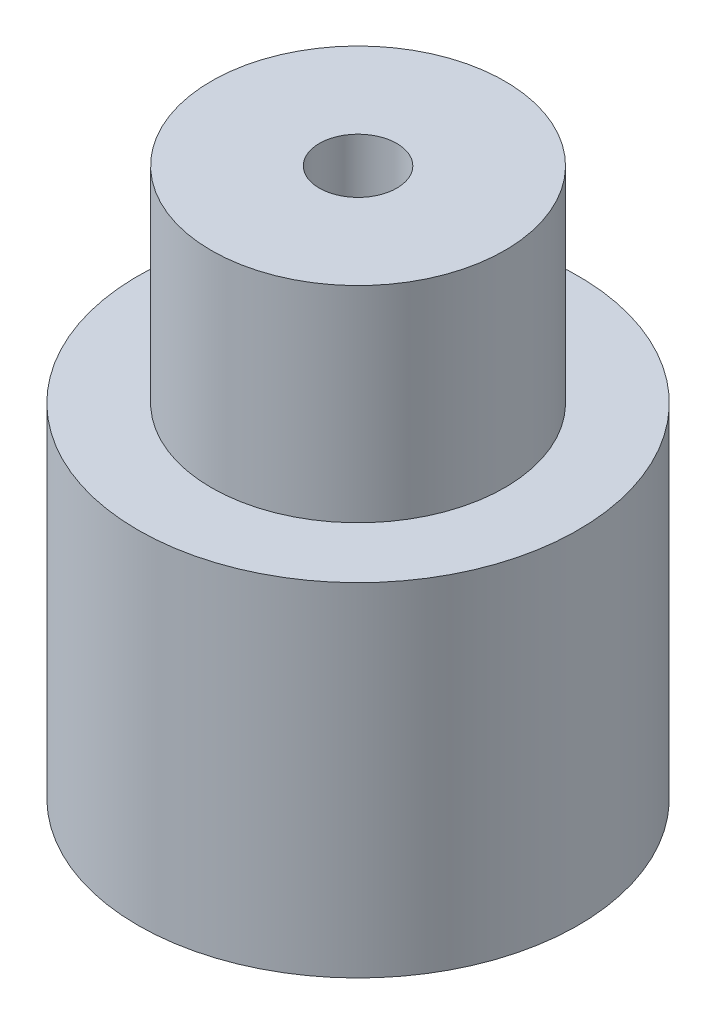
ISO-10303-21;
HEADER;
FILE_DESCRIPTION(('STEP AP214'),'2;1');
FILE_NAME('part.step','',(''),(''),'','','');
FILE_SCHEMA(('AUTOMOTIVE_DESIGN { 1 0 10303 214 1 1 1 1 }'));
ENDSEC;
DATA;
#1=APPLICATION_CONTEXT('core data for automotive mechanical design processes');
#2=APPLICATION_PROTOCOL_DEFINITION('international standard','automotive_design',2000,#1);
#3=PRODUCT_CONTEXT('',#1,'mechanical');
#4=PRODUCT('Part','Part','',(#3));
#5=PRODUCT_RELATED_PRODUCT_CATEGORY('part','',(#4));
#6=PRODUCT_DEFINITION_FORMATION('','',#4);
#7=PRODUCT_DEFINITION_CONTEXT('part definition',#1,'design');
#8=PRODUCT_DEFINITION('design','',#6,#7);
#9=PRODUCT_DEFINITION_SHAPE('','',#8);
#10=(LENGTH_UNIT() NAMED_UNIT(*) SI_UNIT(.MILLI.,.METRE.));
#11=(NAMED_UNIT(*) PLANE_ANGLE_UNIT() SI_UNIT($,.RADIAN.));
#12=(NAMED_UNIT(*) SI_UNIT($,.STERADIAN.) SOLID_ANGLE_UNIT());
#13=UNCERTAINTY_MEASURE_WITH_UNIT(LENGTH_MEASURE(1.E-05),#10,'distance_accuracy_value','');
#14=(GEOMETRIC_REPRESENTATION_CONTEXT(3) GLOBAL_UNCERTAINTY_ASSIGNED_CONTEXT((#13)) GLOBAL_UNIT_ASSIGNED_CONTEXT((#10,
#11,#12)) REPRESENTATION_CONTEXT('',''));
#15=CARTESIAN_POINT('',(0.,0.,0.));
#16=DIRECTION('',(0.,0.,1.));
#17=DIRECTION('',(1.,0.,0.));
#18=AXIS2_PLACEMENT_3D('',#15,#16,#17);
#19=CARTESIAN_POINT('',(0.,14.,0.));
#20=DIRECTION('',(0.,-1.,0.));
#21=DIRECTION('',(0.,0.,-1.));
#22=AXIS2_PLACEMENT_3D('',#19,#20,#21);
#23=CYLINDRICAL_SURFACE('',#22,9.);
#24=CARTESIAN_POINT('',(0.,14.,0.));
#25=DIRECTION('',(0.,1.,0.));
#26=DIRECTION('',(0.,0.,1.));
#27=AXIS2_PLACEMENT_3D('',#24,#25,#26);
#28=CIRCLE('',#27,9.);
#29=CARTESIAN_POINT('',(0.,14.,9.));
#30=VERTEX_POINT('',#29);
#31=EDGE_CURVE('E40',#30,#30,#28,.T.);
#32=ORIENTED_EDGE('',*,*,#31,.F.);
#33=EDGE_LOOP('',(#32));
#34=FACE_BOUND('',#33,.T.);
#35=CARTESIAN_POINT('',(0.,0.,0.));
#36=DIRECTION('',(0.,1.,0.));
#37=DIRECTION('',(0.,0.,1.));
#38=AXIS2_PLACEMENT_3D('',#35,#36,#37);
#39=CIRCLE('',#38,9.);
#40=CARTESIAN_POINT('',(0.,0.,9.));
#41=VERTEX_POINT('',#40);
#42=EDGE_CURVE('E36',#41,#41,#39,.T.);
#43=ORIENTED_EDGE('',*,*,#42,.T.);
#44=EDGE_LOOP('',(#43));
#45=FACE_BOUND('',#44,.T.);
#46=ADVANCED_FACE('F33',(#34,#45),#23,.T.);
#47=CARTESIAN_POINT('',(0.,14.,0.));
#48=DIRECTION('',(0.,1.,0.));
#49=DIRECTION('',(0.,0.,1.));
#50=AXIS2_PLACEMENT_3D('',#47,#48,#49);
#51=PLANE('',#50);
#52=CARTESIAN_POINT('',(0.,14.,0.));
#53=DIRECTION('',(0.,1.,0.));
#54=DIRECTION('',(0.,0.,1.));
#55=AXIS2_PLACEMENT_3D('',#52,#53,#54);
#56=CIRCLE('',#55,6.);
#57=CARTESIAN_POINT('',(0.,14.,6.));
#58=VERTEX_POINT('',#57);
#59=EDGE_CURVE('E10',#58,#58,#56,.T.);
#60=ORIENTED_EDGE('',*,*,#59,.F.);
#61=EDGE_LOOP('',(#60));
#62=FACE_BOUND('',#61,.T.);
#63=ORIENTED_EDGE('',*,*,#31,.T.);
#64=EDGE_LOOP('',(#63));
#65=FACE_BOUND('',#64,.T.);
#66=ADVANCED_FACE('F72',(#62,#65),#51,.T.);
#67=CARTESIAN_POINT('',(0.,0.,0.));
#68=DIRECTION('',(0.,1.,0.));
#69=DIRECTION('',(0.,0.,1.));
#70=AXIS2_PLACEMENT_3D('',#67,#68,#69);
#71=PLANE('',#70);
#72=CARTESIAN_POINT('',(0.,0.,0.));
#73=DIRECTION('',(0.,1.,0.));
#74=DIRECTION('',(0.,0.,1.));
#75=AXIS2_PLACEMENT_3D('',#72,#73,#74);
#76=CIRCLE('',#75,1.585);
#77=CARTESIAN_POINT('',(0.,0.,1.585));
#78=VERTEX_POINT('',#77);
#79=EDGE_CURVE('E49',#78,#78,#76,.F.);
#80=ORIENTED_EDGE('',*,*,#79,.F.);
#81=EDGE_LOOP('',(#80));
#82=FACE_BOUND('',#81,.T.);
#83=ORIENTED_EDGE('',*,*,#42,.F.);
#84=EDGE_LOOP('',(#83));
#85=FACE_BOUND('',#84,.T.);
#86=ADVANCED_FACE('F67',(#82,#85),#71,.F.);
#87=CARTESIAN_POINT('',(0.,22.4,0.));
#88=DIRECTION('',(0.,-1.,0.));
#89=DIRECTION('',(0.,0.,-1.));
#90=AXIS2_PLACEMENT_3D('',#87,#88,#89);
#91=CYLINDRICAL_SURFACE('',#90,6.);
#92=CARTESIAN_POINT('',(0.,22.4,0.));
#93=DIRECTION('',(0.,1.,0.));
#94=DIRECTION('',(0.,0.,1.));
#95=AXIS2_PLACEMENT_3D('',#92,#93,#94);
#96=CIRCLE('',#95,6.);
#97=CARTESIAN_POINT('',(0.,22.4,6.));
#98=VERTEX_POINT('',#97);
#99=EDGE_CURVE('E46',#98,#98,#96,.T.);
#100=ORIENTED_EDGE('',*,*,#99,.F.);
#101=EDGE_LOOP('',(#100));
#102=FACE_BOUND('',#101,.T.);
#103=ORIENTED_EDGE('',*,*,#59,.T.);
#104=EDGE_LOOP('',(#103));
#105=FACE_BOUND('',#104,.T.);
#106=ADVANCED_FACE('F62',(#102,#105),#91,.T.);
#107=CARTESIAN_POINT('',(0.,22.4,0.));
#108=DIRECTION('',(0.,1.,0.));
#109=DIRECTION('',(0.,0.,1.));
#110=AXIS2_PLACEMENT_3D('',#107,#108,#109);
#111=PLANE('',#110);
#112=CARTESIAN_POINT('',(0.,22.4,0.));
#113=DIRECTION('',(0.,1.,0.));
#114=DIRECTION('',(0.,0.,1.));
#115=AXIS2_PLACEMENT_3D('',#112,#113,#114);
#116=CIRCLE('',#115,1.585);
#117=CARTESIAN_POINT('',(0.,22.4,1.585));
#118=VERTEX_POINT('',#117);
#119=EDGE_CURVE('E52',#118,#118,#116,.T.);
#120=ORIENTED_EDGE('',*,*,#119,.F.);
#121=EDGE_LOOP('',(#120));
#122=FACE_BOUND('',#121,.T.);
#123=ORIENTED_EDGE('',*,*,#99,.T.);
#124=EDGE_LOOP('',(#123));
#125=FACE_BOUND('',#124,.T.);
#126=ADVANCED_FACE('F59',(#122,#125),#111,.T.);
#127=CARTESIAN_POINT('',(0.,-0.001000000000001,0.));
#128=DIRECTION('',(0.,1.,0.));
#129=DIRECTION('',(0.,0.,1.));
#130=AXIS2_PLACEMENT_3D('',#127,#128,#129);
#131=CYLINDRICAL_SURFACE('',#130,1.585);
#132=ORIENTED_EDGE('',*,*,#119,.T.);
#133=EDGE_LOOP('',(#132));
#134=FACE_BOUND('',#133,.T.);
#135=ORIENTED_EDGE('',*,*,#79,.T.);
#136=EDGE_LOOP('',(#135));
#137=FACE_BOUND('',#136,.T.);
#138=ADVANCED_FACE('F56',(#134,#137),#131,.F.);
#139=CLOSED_SHELL('',(#46,#66,#86,#106,#126,#138));
#140=MANIFOLD_SOLID_BREP('B2',#139);
#141=ADVANCED_BREP_SHAPE_REPRESENTATION('',(#18,#140),#14);
#142=SHAPE_DEFINITION_REPRESENTATION(#9,#141);
ENDSEC;
END-ISO-10303-21;
